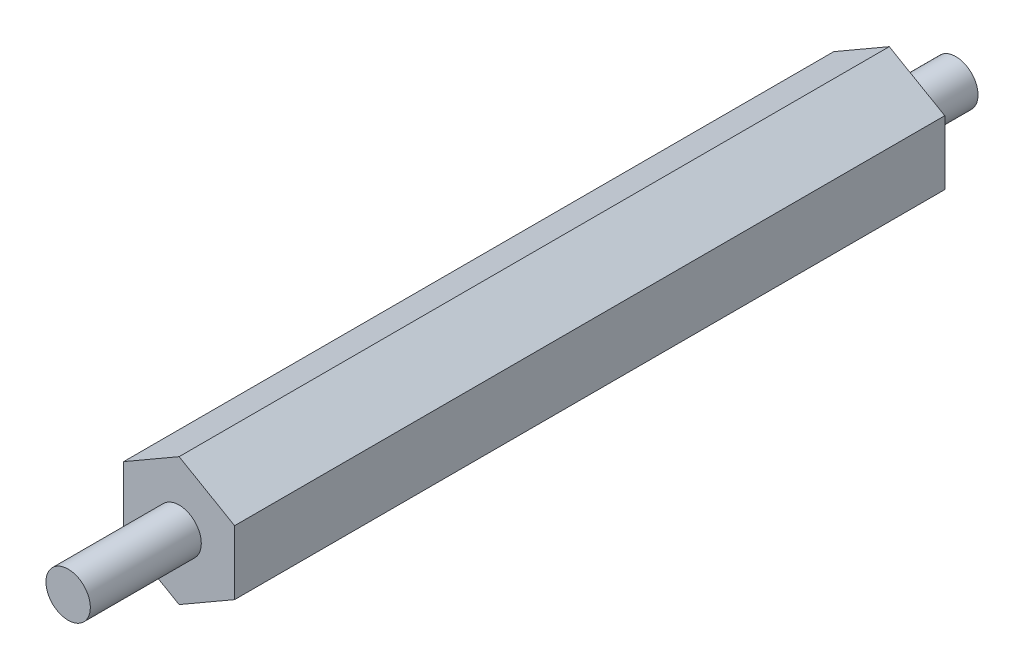
ISO-10303-21;
HEADER;
FILE_DESCRIPTION(('STEP AP214'),'2;1');
FILE_NAME('part.step','',(''),(''),'','','');
FILE_SCHEMA(('AUTOMOTIVE_DESIGN { 1 0 10303 214 1 1 1 1 }'));
ENDSEC;
DATA;
#1=APPLICATION_CONTEXT('core data for automotive mechanical design processes');
#2=APPLICATION_PROTOCOL_DEFINITION('international standard','automotive_design',2000,#1);
#3=PRODUCT_CONTEXT('',#1,'mechanical');
#4=PRODUCT('Part','Part','',(#3));
#5=PRODUCT_RELATED_PRODUCT_CATEGORY('part','',(#4));
#6=PRODUCT_DEFINITION_FORMATION('','',#4);
#7=PRODUCT_DEFINITION_CONTEXT('part definition',#1,'design');
#8=PRODUCT_DEFINITION('design','',#6,#7);
#9=PRODUCT_DEFINITION_SHAPE('','',#8);
#10=(LENGTH_UNIT() NAMED_UNIT(*) SI_UNIT(.MILLI.,.METRE.));
#11=(NAMED_UNIT(*) PLANE_ANGLE_UNIT() SI_UNIT($,.RADIAN.));
#12=(NAMED_UNIT(*) SI_UNIT($,.STERADIAN.) SOLID_ANGLE_UNIT());
#13=UNCERTAINTY_MEASURE_WITH_UNIT(LENGTH_MEASURE(1.E-05),#10,'distance_accuracy_value','');
#14=(GEOMETRIC_REPRESENTATION_CONTEXT(3) GLOBAL_UNCERTAINTY_ASSIGNED_CONTEXT((#13)) GLOBAL_UNIT_ASSIGNED_CONTEXT((#10,
#11,#12)) REPRESENTATION_CONTEXT('',''));
#15=CARTESIAN_POINT('',(0.,0.,0.));
#16=DIRECTION('',(0.,0.,1.));
#17=DIRECTION('',(1.,0.,0.));
#18=AXIS2_PLACEMENT_3D('',#15,#16,#17);
#19=CARTESIAN_POINT('',(2.5,-18.4081477220205,32.));
#20=DIRECTION('',(-0.5,-0.866025403784438,0.));
#21=DIRECTION('',(0.866025403784439,-0.5,0.));
#22=AXIS2_PLACEMENT_3D('',#19,#20,#21);
#23=PLANE('',#22);
#24=DIRECTION('',(-0.866025403784438,0.5,0.));
#25=VECTOR('',#24,1.);
#26=CARTESIAN_POINT('',(2.5,-18.4081477220205,0.));
#27=LINE('',#26,#25);
#28=CARTESIAN_POINT('',(2.5,-18.4081477220205,0.));
#29=VERTEX_POINT('',#28);
#30=CARTESIAN_POINT('',(0.,-16.9647720490464,0.));
#31=VERTEX_POINT('',#30);
#32=EDGE_CURVE('E131',#29,#31,#27,.T.);
#33=ORIENTED_EDGE('',*,*,#32,.T.);
#34=DIRECTION('',(0.,0.,-1.));
#35=VECTOR('',#34,1.);
#36=CARTESIAN_POINT('',(0.,-16.9647720490464,32.));
#37=LINE('',#36,#35);
#38=CARTESIAN_POINT('',(0.,-16.9647720490464,32.));
#39=VERTEX_POINT('',#38);
#40=EDGE_CURVE('E42',#39,#31,#37,.T.);
#41=ORIENTED_EDGE('',*,*,#40,.F.);
#42=DIRECTION('',(-0.866025403784438,0.5,0.));
#43=VECTOR('',#42,1.);
#44=CARTESIAN_POINT('',(2.5,-18.4081477220205,32.));
#45=LINE('',#44,#43);
#46=CARTESIAN_POINT('',(2.5,-18.4081477220205,32.));
#47=VERTEX_POINT('',#46);
#48=EDGE_CURVE('E148',#47,#39,#45,.T.);
#49=ORIENTED_EDGE('',*,*,#48,.F.);
#50=DIRECTION('',(0.,0.,-1.));
#51=VECTOR('',#50,1.);
#52=CARTESIAN_POINT('',(2.5,-18.4081477220205,32.));
#53=LINE('',#52,#51);
#54=EDGE_CURVE('E127',#47,#29,#53,.T.);
#55=ORIENTED_EDGE('',*,*,#54,.T.);
#56=EDGE_LOOP('',(#33,#41,#49,#55));
#57=FACE_BOUND('',#56,.T.);
#58=ADVANCED_FACE('F39',(#57),#23,.F.);
#59=CARTESIAN_POINT('',(0.,-16.9647720490464,32.));
#60=DIRECTION('',(0.500000000000001,-0.866025403784438,0.));
#61=DIRECTION('',(0.866025403784438,0.500000000000001,0.));
#62=AXIS2_PLACEMENT_3D('',#59,#60,#61);
#63=PLANE('',#62);
#64=DIRECTION('',(-0.866025403784438,-0.500000000000001,0.));
#65=VECTOR('',#64,1.);
#66=CARTESIAN_POINT('',(0.,-16.9647720490464,0.));
#67=LINE('',#66,#65);
#68=CARTESIAN_POINT('',(-2.5,-18.4081477220205,0.));
#69=VERTEX_POINT('',#68);
#70=EDGE_CURVE('E135',#31,#69,#67,.T.);
#71=ORIENTED_EDGE('',*,*,#70,.T.);
#72=DIRECTION('',(0.,0.,-1.));
#73=VECTOR('',#72,1.);
#74=CARTESIAN_POINT('',(-2.5,-18.4081477220205,32.));
#75=LINE('',#74,#73);
#76=CARTESIAN_POINT('',(-2.5,-18.4081477220205,32.));
#77=VERTEX_POINT('',#76);
#78=EDGE_CURVE('E154',#77,#69,#75,.T.);
#79=ORIENTED_EDGE('',*,*,#78,.F.);
#80=DIRECTION('',(-0.866025403784438,-0.500000000000001,0.));
#81=VECTOR('',#80,1.);
#82=CARTESIAN_POINT('',(0.,-16.9647720490464,32.));
#83=LINE('',#82,#81);
#84=EDGE_CURVE('E96',#39,#77,#83,.T.);
#85=ORIENTED_EDGE('',*,*,#84,.F.);
#86=ORIENTED_EDGE('',*,*,#40,.T.);
#87=EDGE_LOOP('',(#71,#79,#85,#86));
#88=FACE_BOUND('',#87,.T.);
#89=ADVANCED_FACE('F208',(#88),#63,.F.);
#90=CARTESIAN_POINT('',(-2.5,-18.4081477220205,32.));
#91=DIRECTION('',(1.,0.,0.));
#92=DIRECTION('',(0.,1.,0.));
#93=AXIS2_PLACEMENT_3D('',#90,#91,#92);
#94=PLANE('',#93);
#95=DIRECTION('',(0.,-1.,0.));
#96=VECTOR('',#95,1.);
#97=CARTESIAN_POINT('',(-2.5,-18.4081477220205,0.));
#98=LINE('',#97,#96);
#99=CARTESIAN_POINT('',(-2.5,-21.2948990679686,0.));
#100=VERTEX_POINT('',#99);
#101=EDGE_CURVE('E139',#69,#100,#98,.T.);
#102=ORIENTED_EDGE('',*,*,#101,.T.);
#103=DIRECTION('',(0.,0.,-1.));
#104=VECTOR('',#103,1.);
#105=CARTESIAN_POINT('',(-2.5,-21.2948990679686,32.));
#106=LINE('',#105,#104);
#107=CARTESIAN_POINT('',(-2.5,-21.2948990679686,32.));
#108=VERTEX_POINT('',#107);
#109=EDGE_CURVE('E120',#108,#100,#106,.T.);
#110=ORIENTED_EDGE('',*,*,#109,.F.);
#111=DIRECTION('',(0.,-1.,0.));
#112=VECTOR('',#111,1.);
#113=CARTESIAN_POINT('',(-2.5,-18.4081477220205,32.));
#114=LINE('',#113,#112);
#115=EDGE_CURVE('E109',#77,#108,#114,.T.);
#116=ORIENTED_EDGE('',*,*,#115,.F.);
#117=ORIENTED_EDGE('',*,*,#78,.T.);
#118=EDGE_LOOP('',(#102,#110,#116,#117));
#119=FACE_BOUND('',#118,.T.);
#120=ADVANCED_FACE('F212',(#119),#94,.F.);
#121=CARTESIAN_POINT('',(-2.5,-21.2948990679686,32.));
#122=DIRECTION('',(0.5,0.866025403784439,0.));
#123=DIRECTION('',(-0.866025403784439,0.5,0.));
#124=AXIS2_PLACEMENT_3D('',#121,#122,#123);
#125=PLANE('',#124);
#126=DIRECTION('',(0.866025403784439,-0.5,0.));
#127=VECTOR('',#126,1.);
#128=CARTESIAN_POINT('',(-2.5,-21.2948990679686,0.));
#129=LINE('',#128,#127);
#130=CARTESIAN_POINT('',(0.,-22.7382747409427,0.));
#131=VERTEX_POINT('',#130);
#132=EDGE_CURVE('E118',#100,#131,#129,.T.);
#133=ORIENTED_EDGE('',*,*,#132,.T.);
#134=DIRECTION('',(0.,0.,-1.));
#135=VECTOR('',#134,1.);
#136=CARTESIAN_POINT('',(0.,-22.7382747409427,32.));
#137=LINE('',#136,#135);
#138=CARTESIAN_POINT('',(0.,-22.7382747409427,32.));
#139=VERTEX_POINT('',#138);
#140=EDGE_CURVE('E115',#139,#131,#137,.T.);
#141=ORIENTED_EDGE('',*,*,#140,.F.);
#142=DIRECTION('',(0.866025403784439,-0.5,0.));
#143=VECTOR('',#142,1.);
#144=CARTESIAN_POINT('',(-2.5,-21.2948990679686,32.));
#145=LINE('',#144,#143);
#146=EDGE_CURVE('E103',#108,#139,#145,.T.);
#147=ORIENTED_EDGE('',*,*,#146,.F.);
#148=ORIENTED_EDGE('',*,*,#109,.T.);
#149=EDGE_LOOP('',(#133,#141,#147,#148));
#150=FACE_BOUND('',#149,.T.);
#151=ADVANCED_FACE('F116',(#150),#125,.F.);
#152=CARTESIAN_POINT('',(0.,-22.7382747409427,32.));
#153=DIRECTION('',(-0.5,0.866025403784439,0.));
#154=DIRECTION('',(-0.866025403784438,-0.5,0.));
#155=AXIS2_PLACEMENT_3D('',#152,#153,#154);
#156=PLANE('',#155);
#157=DIRECTION('',(0.866025403784438,0.5,0.));
#158=VECTOR('',#157,1.);
#159=CARTESIAN_POINT('',(0.,-22.7382747409427,0.));
#160=LINE('',#159,#158);
#161=CARTESIAN_POINT('',(2.5,-21.2948990679686,0.));
#162=VERTEX_POINT('',#161);
#163=EDGE_CURVE('E81',#131,#162,#160,.T.);
#164=ORIENTED_EDGE('',*,*,#163,.T.);
#165=DIRECTION('',(0.,0.,-1.));
#166=VECTOR('',#165,1.);
#167=CARTESIAN_POINT('',(2.5,-21.2948990679686,32.));
#168=LINE('',#167,#166);
#169=CARTESIAN_POINT('',(2.5,-21.2948990679686,32.));
#170=VERTEX_POINT('',#169);
#171=EDGE_CURVE('E121',#170,#162,#168,.T.);
#172=ORIENTED_EDGE('',*,*,#171,.F.);
#173=DIRECTION('',(0.866025403784438,0.5,0.));
#174=VECTOR('',#173,1.);
#175=CARTESIAN_POINT('',(0.,-22.7382747409427,32.));
#176=LINE('',#175,#174);
#177=EDGE_CURVE('E107',#139,#170,#176,.T.);
#178=ORIENTED_EDGE('',*,*,#177,.F.);
#179=ORIENTED_EDGE('',*,*,#140,.T.);
#180=EDGE_LOOP('',(#164,#172,#178,#179));
#181=FACE_BOUND('',#180,.T.);
#182=ADVANCED_FACE('F123',(#181),#156,.F.);
#183=CARTESIAN_POINT('',(2.5,-21.2948990679686,32.));
#184=DIRECTION('',(-1.,0.,0.));
#185=DIRECTION('',(0.,0.,1.));
#186=AXIS2_PLACEMENT_3D('',#183,#184,#185);
#187=PLANE('',#186);
#188=DIRECTION('',(0.,1.,0.));
#189=VECTOR('',#188,1.);
#190=CARTESIAN_POINT('',(2.5,-21.2948990679686,0.));
#191=LINE('',#190,#189);
#192=EDGE_CURVE('E87',#162,#29,#191,.T.);
#193=ORIENTED_EDGE('',*,*,#192,.T.);
#194=ORIENTED_EDGE('',*,*,#54,.F.);
#195=DIRECTION('',(0.,1.,0.));
#196=VECTOR('',#195,1.);
#197=CARTESIAN_POINT('',(2.5,-21.2948990679686,32.));
#198=LINE('',#197,#196);
#199=EDGE_CURVE('E58',#170,#47,#198,.T.);
#200=ORIENTED_EDGE('',*,*,#199,.F.);
#201=ORIENTED_EDGE('',*,*,#171,.T.);
#202=EDGE_LOOP('',(#193,#194,#200,#201));
#203=FACE_BOUND('',#202,.T.);
#204=ADVANCED_FACE('F197',(#203),#187,.F.);
#205=CARTESIAN_POINT('',(0.,0.,32.));
#206=DIRECTION('',(0.,0.,1.));
#207=DIRECTION('',(1.,0.,0.));
#208=AXIS2_PLACEMENT_3D('',#205,#206,#207);
#209=PLANE('',#208);
#210=CARTESIAN_POINT('',(0.,-19.8515233949946,32.));
#211=DIRECTION('',(0.,0.,1.));
#212=DIRECTION('',(1.,0.,0.));
#213=AXIS2_PLACEMENT_3D('',#210,#211,#212);
#214=CIRCLE('',#213,1.);
#215=CARTESIAN_POINT('',(1.,-19.8515233949946,32.));
#216=VERTEX_POINT('',#215);
#217=EDGE_CURVE('E49',#216,#216,#214,.T.);
#218=ORIENTED_EDGE('',*,*,#217,.F.);
#219=EDGE_LOOP('',(#218));
#220=FACE_BOUND('',#219,.T.);
#221=ORIENTED_EDGE('',*,*,#48,.T.);
#222=ORIENTED_EDGE('',*,*,#84,.T.);
#223=ORIENTED_EDGE('',*,*,#115,.T.);
#224=ORIENTED_EDGE('',*,*,#146,.T.);
#225=ORIENTED_EDGE('',*,*,#177,.T.);
#226=ORIENTED_EDGE('',*,*,#199,.T.);
#227=EDGE_LOOP('',(#221,#222,#223,#224,#225,#226));
#228=FACE_BOUND('',#227,.T.);
#229=ADVANCED_FACE('F105',(#220,#228),#209,.T.);
#230=CARTESIAN_POINT('',(0.,0.,0.));
#231=DIRECTION('',(0.,0.,1.));
#232=DIRECTION('',(1.,0.,0.));
#233=AXIS2_PLACEMENT_3D('',#230,#231,#232);
#234=PLANE('',#233);
#235=CARTESIAN_POINT('',(0.,-19.8515233949946,0.));
#236=DIRECTION('',(0.,0.,-1.));
#237=DIRECTION('',(-1.,0.,0.));
#238=AXIS2_PLACEMENT_3D('',#235,#236,#237);
#239=CIRCLE('',#238,1.);
#240=CARTESIAN_POINT('',(-1.,-19.8515233949946,0.));
#241=VERTEX_POINT('',#240);
#242=EDGE_CURVE('E11',#241,#241,#239,.T.);
#243=ORIENTED_EDGE('',*,*,#242,.F.);
#244=EDGE_LOOP('',(#243));
#245=FACE_BOUND('',#244,.T.);
#246=ORIENTED_EDGE('',*,*,#32,.F.);
#247=ORIENTED_EDGE('',*,*,#192,.F.);
#248=ORIENTED_EDGE('',*,*,#163,.F.);
#249=ORIENTED_EDGE('',*,*,#132,.F.);
#250=ORIENTED_EDGE('',*,*,#101,.F.);
#251=ORIENTED_EDGE('',*,*,#70,.F.);
#252=EDGE_LOOP('',(#246,#247,#248,#249,#250,#251));
#253=FACE_BOUND('',#252,.T.);
#254=ADVANCED_FACE('F189',(#245,#253),#234,.F.);
#255=CARTESIAN_POINT('',(0.,-19.8515233949946,37.));
#256=DIRECTION('',(0.,0.,-1.));
#257=DIRECTION('',(-1.,0.,0.));
#258=AXIS2_PLACEMENT_3D('',#255,#256,#257);
#259=CYLINDRICAL_SURFACE('',#258,1.);
#260=CARTESIAN_POINT('',(0.,-19.8515233949946,37.));
#261=DIRECTION('',(0.,0.,1.));
#262=DIRECTION('',(1.,0.,0.));
#263=AXIS2_PLACEMENT_3D('',#260,#261,#262);
#264=CIRCLE('',#263,1.);
#265=CARTESIAN_POINT('',(1.,-19.8515233949946,37.));
#266=VERTEX_POINT('',#265);
#267=EDGE_CURVE('E136',#266,#266,#264,.T.);
#268=ORIENTED_EDGE('',*,*,#267,.F.);
#269=EDGE_LOOP('',(#268));
#270=FACE_BOUND('',#269,.T.);
#271=ORIENTED_EDGE('',*,*,#217,.T.);
#272=EDGE_LOOP('',(#271));
#273=FACE_BOUND('',#272,.T.);
#274=ADVANCED_FACE('F192',(#270,#273),#259,.T.);
#275=CARTESIAN_POINT('',(0.,-19.8515233949946,37.));
#276=DIRECTION('',(0.,0.,1.));
#277=DIRECTION('',(1.,0.,0.));
#278=AXIS2_PLACEMENT_3D('',#275,#276,#277);
#279=PLANE('',#278);
#280=ORIENTED_EDGE('',*,*,#267,.T.);
#281=EDGE_LOOP('',(#280));
#282=FACE_BOUND('',#281,.T.);
#283=ADVANCED_FACE('F185',(#282),#279,.T.);
#284=CARTESIAN_POINT('',(0.,-19.8515233949946,-3.));
#285=DIRECTION('',(0.,0.,1.));
#286=DIRECTION('',(1.,0.,0.));
#287=AXIS2_PLACEMENT_3D('',#284,#285,#286);
#288=CYLINDRICAL_SURFACE('',#287,1.);
#289=CARTESIAN_POINT('',(0.,-19.8515233949946,-3.));
#290=DIRECTION('',(0.,0.,-1.));
#291=DIRECTION('',(-1.,0.,0.));
#292=AXIS2_PLACEMENT_3D('',#289,#290,#291);
#293=CIRCLE('',#292,1.);
#294=CARTESIAN_POINT('',(-1.,-19.8515233949946,-3.));
#295=VERTEX_POINT('',#294);
#296=EDGE_CURVE('E175',#295,#295,#293,.T.);
#297=ORIENTED_EDGE('',*,*,#296,.F.);
#298=EDGE_LOOP('',(#297));
#299=FACE_BOUND('',#298,.T.);
#300=ORIENTED_EDGE('',*,*,#242,.T.);
#301=EDGE_LOOP('',(#300));
#302=FACE_BOUND('',#301,.T.);
#303=ADVANCED_FACE('F182',(#299,#302),#288,.T.);
#304=CARTESIAN_POINT('',(0.,-19.8515233949946,-3.));
#305=DIRECTION('',(0.,0.,-1.));
#306=DIRECTION('',(-1.,0.,0.));
#307=AXIS2_PLACEMENT_3D('',#304,#305,#306);
#308=PLANE('',#307);
#309=ORIENTED_EDGE('',*,*,#296,.T.);
#310=EDGE_LOOP('',(#309));
#311=FACE_BOUND('',#310,.T.);
#312=ADVANCED_FACE('F180',(#311),#308,.T.);
#313=CLOSED_SHELL('',(#58,#89,#120,#151,#182,#204,#229,#254,#274,#283,#303,#312));
#314=MANIFOLD_SOLID_BREP('B2',#313);
#315=ADVANCED_BREP_SHAPE_REPRESENTATION('',(#18,#314),#14);
#316=SHAPE_DEFINITION_REPRESENTATION(#9,#315);
ENDSEC;
END-ISO-10303-21;
